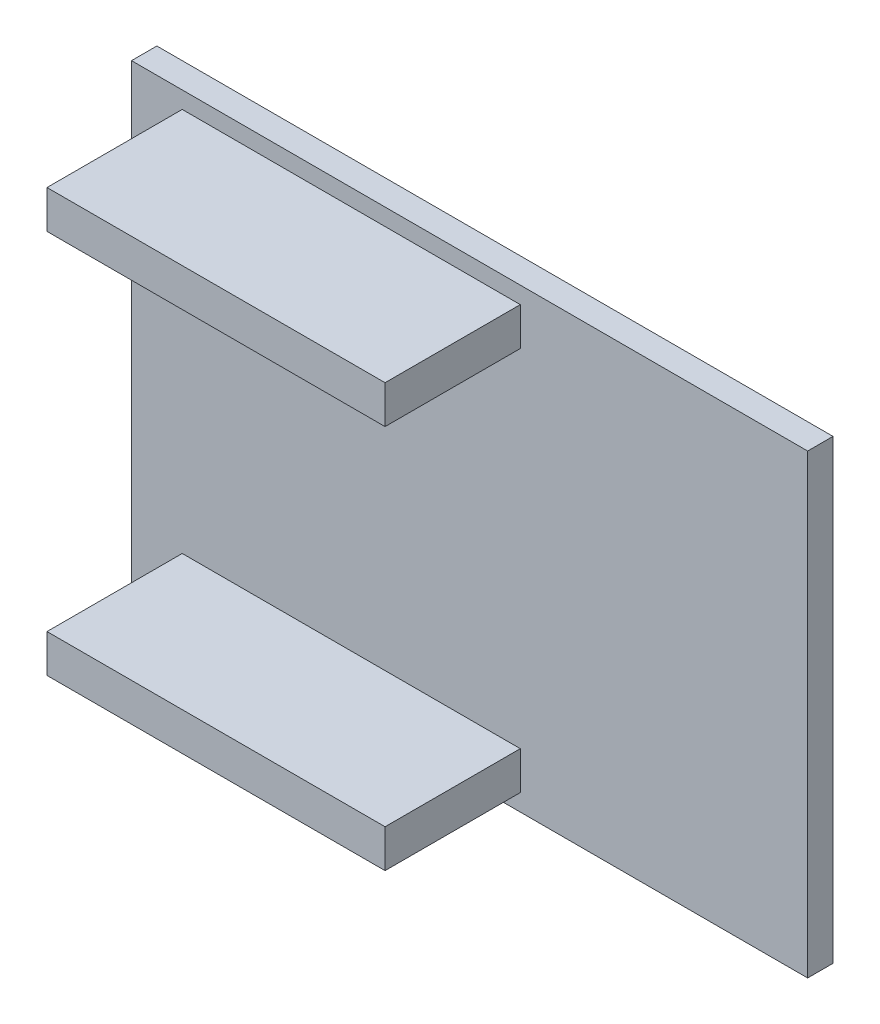
ISO-10303-21;
HEADER;
FILE_DESCRIPTION(('STEP AP214'),'2;1');
FILE_NAME('part.step','',(''),(''),'','','');
FILE_SCHEMA(('AUTOMOTIVE_DESIGN { 1 0 10303 214 1 1 1 1 }'));
ENDSEC;
DATA;
#1=APPLICATION_CONTEXT('core data for automotive mechanical design processes');
#2=APPLICATION_PROTOCOL_DEFINITION('international standard','automotive_design',2000,#1);
#3=PRODUCT_CONTEXT('',#1,'mechanical');
#4=PRODUCT('Part','Part','',(#3));
#5=PRODUCT_RELATED_PRODUCT_CATEGORY('part','',(#4));
#6=PRODUCT_DEFINITION_FORMATION('','',#4);
#7=PRODUCT_DEFINITION_CONTEXT('part definition',#1,'design');
#8=PRODUCT_DEFINITION('design','',#6,#7);
#9=PRODUCT_DEFINITION_SHAPE('','',#8);
#10=(LENGTH_UNIT() NAMED_UNIT(*) SI_UNIT(.MILLI.,.METRE.));
#11=(NAMED_UNIT(*) PLANE_ANGLE_UNIT() SI_UNIT($,.RADIAN.));
#12=(NAMED_UNIT(*) SI_UNIT($,.STERADIAN.) SOLID_ANGLE_UNIT());
#13=UNCERTAINTY_MEASURE_WITH_UNIT(LENGTH_MEASURE(1.E-05),#10,'distance_accuracy_value','');
#14=(GEOMETRIC_REPRESENTATION_CONTEXT(3) GLOBAL_UNCERTAINTY_ASSIGNED_CONTEXT((#13)) GLOBAL_UNIT_ASSIGNED_CONTEXT((#10,
#11,#12)) REPRESENTATION_CONTEXT('',''));
#15=CARTESIAN_POINT('',(0.,0.,0.));
#16=DIRECTION('',(0.,0.,1.));
#17=DIRECTION('',(1.,0.,0.));
#18=AXIS2_PLACEMENT_3D('',#15,#16,#17);
#19=CARTESIAN_POINT('',(0.,0.,1.5));
#20=DIRECTION('',(0.,0.,-1.));
#21=DIRECTION('',(-1.,0.,0.));
#22=AXIS2_PLACEMENT_3D('',#19,#20,#21);
#23=PLANE('',#22);
#24=DIRECTION('',(-1.,0.,0.));
#25=VECTOR('',#24,1.);
#26=CARTESIAN_POINT('',(3.,12.5,1.5));
#27=LINE('',#26,#25);
#28=CARTESIAN_POINT('',(3.,12.5,1.5));
#29=VERTEX_POINT('',#28);
#30=CARTESIAN_POINT('',(-17.,12.5,1.5));
#31=VERTEX_POINT('',#30);
#32=EDGE_CURVE('E144',#29,#31,#27,.T.);
#33=ORIENTED_EDGE('',*,*,#32,.F.);
#34=DIRECTION('',(0.,1.,0.));
#35=VECTOR('',#34,1.);
#36=CARTESIAN_POINT('',(3.,10.25,1.5));
#37=LINE('',#36,#35);
#38=CARTESIAN_POINT('',(3.,10.25,1.5));
#39=VERTEX_POINT('',#38);
#40=EDGE_CURVE('E157',#39,#29,#37,.T.);
#41=ORIENTED_EDGE('',*,*,#40,.F.);
#42=DIRECTION('',(1.,0.,0.));
#43=VECTOR('',#42,1.);
#44=CARTESIAN_POINT('',(-17.,10.25,1.5));
#45=LINE('',#44,#43);
#46=CARTESIAN_POINT('',(-17.,10.25,1.5));
#47=VERTEX_POINT('',#46);
#48=EDGE_CURVE('E166',#47,#39,#45,.T.);
#49=ORIENTED_EDGE('',*,*,#48,.F.);
#50=DIRECTION('',(0.,-1.,0.));
#51=VECTOR('',#50,1.);
#52=CARTESIAN_POINT('',(-17.,12.5,1.5));
#53=LINE('',#52,#51);
#54=EDGE_CURVE('E147',#31,#47,#53,.T.);
#55=ORIENTED_EDGE('',*,*,#54,.F.);
#56=EDGE_LOOP('',(#33,#41,#49,#55));
#57=FACE_BOUND('',#56,.T.);
#58=DIRECTION('',(0.,-1.,0.));
#59=VECTOR('',#58,1.);
#60=CARTESIAN_POINT('',(-20.,13.5,1.5));
#61=LINE('',#60,#59);
#62=CARTESIAN_POINT('',(-20.,13.5,1.5));
#63=VERTEX_POINT('',#62);
#64=CARTESIAN_POINT('',(-20.,-13.5,1.5));
#65=VERTEX_POINT('',#64);
#66=EDGE_CURVE('E183',#63,#65,#61,.T.);
#67=ORIENTED_EDGE('',*,*,#66,.T.);
#68=DIRECTION('',(1.,0.,0.));
#69=VECTOR('',#68,1.);
#70=CARTESIAN_POINT('',(20.,-13.5,1.5));
#71=LINE('',#70,#69);
#72=CARTESIAN_POINT('',(20.,-13.5,1.5));
#73=VERTEX_POINT('',#72);
#74=EDGE_CURVE('E186',#65,#73,#71,.T.);
#75=ORIENTED_EDGE('',*,*,#74,.T.);
#76=DIRECTION('',(0.,1.,0.));
#77=VECTOR('',#76,1.);
#78=CARTESIAN_POINT('',(20.,13.5,1.5));
#79=LINE('',#78,#77);
#80=CARTESIAN_POINT('',(20.,13.5,1.5));
#81=VERTEX_POINT('',#80);
#82=EDGE_CURVE('E189',#73,#81,#79,.T.);
#83=ORIENTED_EDGE('',*,*,#82,.T.);
#84=DIRECTION('',(-1.,0.,0.));
#85=VECTOR('',#84,1.);
#86=CARTESIAN_POINT('',(20.,13.5,1.5));
#87=LINE('',#86,#85);
#88=EDGE_CURVE('E191',#81,#63,#87,.T.);
#89=ORIENTED_EDGE('',*,*,#88,.T.);
#90=EDGE_LOOP('',(#67,#75,#83,#89));
#91=FACE_BOUND('',#90,.T.);
#92=DIRECTION('',(0.,1.,0.));
#93=VECTOR('',#92,1.);
#94=CARTESIAN_POINT('',(3.,-10.25,1.5));
#95=LINE('',#94,#93);
#96=CARTESIAN_POINT('',(3.,-12.5,1.5));
#97=VERTEX_POINT('',#96);
#98=CARTESIAN_POINT('',(3.,-10.25,1.5));
#99=VERTEX_POINT('',#98);
#100=EDGE_CURVE('E143',#97,#99,#95,.T.);
#101=ORIENTED_EDGE('',*,*,#100,.F.);
#102=DIRECTION('',(1.,0.,0.));
#103=VECTOR('',#102,1.);
#104=CARTESIAN_POINT('',(3.,-12.5,1.5));
#105=LINE('',#104,#103);
#106=CARTESIAN_POINT('',(-17.,-12.5,1.5));
#107=VERTEX_POINT('',#106);
#108=EDGE_CURVE('E140',#107,#97,#105,.T.);
#109=ORIENTED_EDGE('',*,*,#108,.F.);
#110=DIRECTION('',(0.,-1.,0.));
#111=VECTOR('',#110,1.);
#112=CARTESIAN_POINT('',(-17.,-12.5,1.5));
#113=LINE('',#112,#111);
#114=CARTESIAN_POINT('',(-17.,-10.25,1.5));
#115=VERTEX_POINT('',#114);
#116=EDGE_CURVE('E54',#115,#107,#113,.T.);
#117=ORIENTED_EDGE('',*,*,#116,.F.);
#118=DIRECTION('',(-1.,0.,0.));
#119=VECTOR('',#118,1.);
#120=CARTESIAN_POINT('',(-17.,-10.25,1.5));
#121=LINE('',#120,#119);
#122=EDGE_CURVE('E49',#99,#115,#121,.T.);
#123=ORIENTED_EDGE('',*,*,#122,.F.);
#124=EDGE_LOOP('',(#101,#109,#117,#123));
#125=FACE_BOUND('',#124,.T.);
#126=ADVANCED_FACE('F34',(#57,#91,#125),#23,.F.);
#127=CARTESIAN_POINT('',(-20.,13.5,1.5));
#128=DIRECTION('',(1.,0.,0.));
#129=DIRECTION('',(0.,0.,-1.));
#130=AXIS2_PLACEMENT_3D('',#127,#128,#129);
#131=PLANE('',#130);
#132=DIRECTION('',(0.,-1.,0.));
#133=VECTOR('',#132,1.);
#134=CARTESIAN_POINT('',(-20.,13.5,0.));
#135=LINE('',#134,#133);
#136=CARTESIAN_POINT('',(-20.,13.5,0.));
#137=VERTEX_POINT('',#136);
#138=CARTESIAN_POINT('',(-20.,-13.5,0.));
#139=VERTEX_POINT('',#138);
#140=EDGE_CURVE('E182',#137,#139,#135,.T.);
#141=ORIENTED_EDGE('',*,*,#140,.T.);
#142=DIRECTION('',(0.,0.,-1.));
#143=VECTOR('',#142,1.);
#144=CARTESIAN_POINT('',(-20.,-13.5,1.5));
#145=LINE('',#144,#143);
#146=EDGE_CURVE('E11',#65,#139,#145,.T.);
#147=ORIENTED_EDGE('',*,*,#146,.F.);
#148=ORIENTED_EDGE('',*,*,#66,.F.);
#149=DIRECTION('',(0.,0.,-1.));
#150=VECTOR('',#149,1.);
#151=CARTESIAN_POINT('',(-20.,13.5,1.5));
#152=LINE('',#151,#150);
#153=EDGE_CURVE('E193',#63,#137,#152,.T.);
#154=ORIENTED_EDGE('',*,*,#153,.T.);
#155=EDGE_LOOP('',(#141,#147,#148,#154));
#156=FACE_BOUND('',#155,.T.);
#157=ADVANCED_FACE('F36',(#156),#131,.F.);
#158=CARTESIAN_POINT('',(20.,-13.5,1.5));
#159=DIRECTION('',(0.,1.,0.));
#160=DIRECTION('',(-1.,0.,0.));
#161=AXIS2_PLACEMENT_3D('',#158,#159,#160);
#162=PLANE('',#161);
#163=DIRECTION('',(1.,0.,0.));
#164=VECTOR('',#163,1.);
#165=CARTESIAN_POINT('',(20.,-13.5,0.));
#166=LINE('',#165,#164);
#167=CARTESIAN_POINT('',(20.,-13.5,0.));
#168=VERTEX_POINT('',#167);
#169=EDGE_CURVE('E196',#139,#168,#166,.T.);
#170=ORIENTED_EDGE('',*,*,#169,.T.);
#171=DIRECTION('',(0.,0.,-1.));
#172=VECTOR('',#171,1.);
#173=CARTESIAN_POINT('',(20.,-13.5,1.5));
#174=LINE('',#173,#172);
#175=EDGE_CURVE('E42',#73,#168,#174,.T.);
#176=ORIENTED_EDGE('',*,*,#175,.F.);
#177=ORIENTED_EDGE('',*,*,#74,.F.);
#178=ORIENTED_EDGE('',*,*,#146,.T.);
#179=EDGE_LOOP('',(#170,#176,#177,#178));
#180=FACE_BOUND('',#179,.T.);
#181=ADVANCED_FACE('F225',(#180),#162,.F.);
#182=CARTESIAN_POINT('',(20.,13.5,1.5));
#183=DIRECTION('',(-1.,0.,0.));
#184=DIRECTION('',(0.,0.,1.));
#185=AXIS2_PLACEMENT_3D('',#182,#183,#184);
#186=PLANE('',#185);
#187=DIRECTION('',(0.,1.,0.));
#188=VECTOR('',#187,1.);
#189=CARTESIAN_POINT('',(20.,13.5,0.));
#190=LINE('',#189,#188);
#191=CARTESIAN_POINT('',(20.,13.5,0.));
#192=VERTEX_POINT('',#191);
#193=EDGE_CURVE('E198',#168,#192,#190,.T.);
#194=ORIENTED_EDGE('',*,*,#193,.T.);
#195=DIRECTION('',(0.,0.,-1.));
#196=VECTOR('',#195,1.);
#197=CARTESIAN_POINT('',(20.,13.5,1.5));
#198=LINE('',#197,#196);
#199=EDGE_CURVE('E203',#81,#192,#198,.T.);
#200=ORIENTED_EDGE('',*,*,#199,.F.);
#201=ORIENTED_EDGE('',*,*,#82,.F.);
#202=ORIENTED_EDGE('',*,*,#175,.T.);
#203=EDGE_LOOP('',(#194,#200,#201,#202));
#204=FACE_BOUND('',#203,.T.);
#205=ADVANCED_FACE('F210',(#204),#186,.F.);
#206=CARTESIAN_POINT('',(20.,13.5,1.5));
#207=DIRECTION('',(0.,-1.,0.));
#208=DIRECTION('',(1.,0.,0.));
#209=AXIS2_PLACEMENT_3D('',#206,#207,#208);
#210=PLANE('',#209);
#211=DIRECTION('',(-1.,0.,0.));
#212=VECTOR('',#211,1.);
#213=CARTESIAN_POINT('',(20.,13.5,0.));
#214=LINE('',#213,#212);
#215=EDGE_CURVE('E187',#192,#137,#214,.T.);
#216=ORIENTED_EDGE('',*,*,#215,.T.);
#217=ORIENTED_EDGE('',*,*,#153,.F.);
#218=ORIENTED_EDGE('',*,*,#88,.F.);
#219=ORIENTED_EDGE('',*,*,#199,.T.);
#220=EDGE_LOOP('',(#216,#217,#218,#219));
#221=FACE_BOUND('',#220,.T.);
#222=ADVANCED_FACE('F219',(#221),#210,.F.);
#223=CARTESIAN_POINT('',(0.,0.,0.));
#224=DIRECTION('',(0.,0.,-1.));
#225=DIRECTION('',(-1.,0.,0.));
#226=AXIS2_PLACEMENT_3D('',#223,#224,#225);
#227=PLANE('',#226);
#228=ORIENTED_EDGE('',*,*,#140,.F.);
#229=ORIENTED_EDGE('',*,*,#215,.F.);
#230=ORIENTED_EDGE('',*,*,#193,.F.);
#231=ORIENTED_EDGE('',*,*,#169,.F.);
#232=EDGE_LOOP('',(#228,#229,#230,#231));
#233=FACE_BOUND('',#232,.T.);
#234=ADVANCED_FACE('F216',(#233),#227,.T.);
#235=CARTESIAN_POINT('',(3.,12.5,9.5));
#236=DIRECTION('',(0.,-1.,0.));
#237=DIRECTION('',(0.,0.,-1.));
#238=AXIS2_PLACEMENT_3D('',#235,#236,#237);
#239=PLANE('',#238);
#240=ORIENTED_EDGE('',*,*,#32,.T.);
#241=DIRECTION('',(0.,0.,-1.));
#242=VECTOR('',#241,1.);
#243=CARTESIAN_POINT('',(-17.,12.5,9.5));
#244=LINE('',#243,#242);
#245=CARTESIAN_POINT('',(-17.,12.5,9.5));
#246=VERTEX_POINT('',#245);
#247=EDGE_CURVE('E179',#246,#31,#244,.T.);
#248=ORIENTED_EDGE('',*,*,#247,.F.);
#249=DIRECTION('',(-1.,0.,0.));
#250=VECTOR('',#249,1.);
#251=CARTESIAN_POINT('',(3.,12.5,9.5));
#252=LINE('',#251,#250);
#253=CARTESIAN_POINT('',(3.,12.5,9.5));
#254=VERTEX_POINT('',#253);
#255=EDGE_CURVE('E153',#254,#246,#252,.T.);
#256=ORIENTED_EDGE('',*,*,#255,.F.);
#257=DIRECTION('',(0.,0.,-1.));
#258=VECTOR('',#257,1.);
#259=CARTESIAN_POINT('',(3.,12.5,9.5));
#260=LINE('',#259,#258);
#261=EDGE_CURVE('E162',#254,#29,#260,.T.);
#262=ORIENTED_EDGE('',*,*,#261,.T.);
#263=EDGE_LOOP('',(#240,#248,#256,#262));
#264=FACE_BOUND('',#263,.T.);
#265=ADVANCED_FACE('F239',(#264),#239,.F.);
#266=CARTESIAN_POINT('',(-17.,12.5,9.5));
#267=DIRECTION('',(1.,0.,0.));
#268=DIRECTION('',(0.,0.,-1.));
#269=AXIS2_PLACEMENT_3D('',#266,#267,#268);
#270=PLANE('',#269);
#271=ORIENTED_EDGE('',*,*,#54,.T.);
#272=DIRECTION('',(0.,0.,-1.));
#273=VECTOR('',#272,1.);
#274=CARTESIAN_POINT('',(-17.,10.25,9.5));
#275=LINE('',#274,#273);
#276=CARTESIAN_POINT('',(-17.,10.25,9.5));
#277=VERTEX_POINT('',#276);
#278=EDGE_CURVE('E176',#277,#47,#275,.T.);
#279=ORIENTED_EDGE('',*,*,#278,.F.);
#280=DIRECTION('',(0.,-1.,0.));
#281=VECTOR('',#280,1.);
#282=CARTESIAN_POINT('',(-17.,12.5,9.5));
#283=LINE('',#282,#281);
#284=EDGE_CURVE('E156',#246,#277,#283,.T.);
#285=ORIENTED_EDGE('',*,*,#284,.F.);
#286=ORIENTED_EDGE('',*,*,#247,.T.);
#287=EDGE_LOOP('',(#271,#279,#285,#286));
#288=FACE_BOUND('',#287,.T.);
#289=ADVANCED_FACE('F258',(#288),#270,.F.);
#290=CARTESIAN_POINT('',(-17.,10.25,9.5));
#291=DIRECTION('',(0.,1.,0.));
#292=DIRECTION('',(0.,0.,1.));
#293=AXIS2_PLACEMENT_3D('',#290,#291,#292);
#294=PLANE('',#293);
#295=ORIENTED_EDGE('',*,*,#48,.T.);
#296=DIRECTION('',(0.,0.,-1.));
#297=VECTOR('',#296,1.);
#298=CARTESIAN_POINT('',(3.,10.25,9.5));
#299=LINE('',#298,#297);
#300=CARTESIAN_POINT('',(3.,10.25,9.5));
#301=VERTEX_POINT('',#300);
#302=EDGE_CURVE('E173',#301,#39,#299,.T.);
#303=ORIENTED_EDGE('',*,*,#302,.F.);
#304=DIRECTION('',(1.,0.,0.));
#305=VECTOR('',#304,1.);
#306=CARTESIAN_POINT('',(-17.,10.25,9.5));
#307=LINE('',#306,#305);
#308=EDGE_CURVE('E159',#277,#301,#307,.T.);
#309=ORIENTED_EDGE('',*,*,#308,.F.);
#310=ORIENTED_EDGE('',*,*,#278,.T.);
#311=EDGE_LOOP('',(#295,#303,#309,#310));
#312=FACE_BOUND('',#311,.T.);
#313=ADVANCED_FACE('F265',(#312),#294,.F.);
#314=CARTESIAN_POINT('',(3.,10.25,9.5));
#315=DIRECTION('',(-1.,0.,0.));
#316=DIRECTION('',(0.,0.,1.));
#317=AXIS2_PLACEMENT_3D('',#314,#315,#316);
#318=PLANE('',#317);
#319=ORIENTED_EDGE('',*,*,#40,.T.);
#320=ORIENTED_EDGE('',*,*,#261,.F.);
#321=DIRECTION('',(0.,1.,0.));
#322=VECTOR('',#321,1.);
#323=CARTESIAN_POINT('',(3.,10.25,9.5));
#324=LINE('',#323,#322);
#325=EDGE_CURVE('E161',#301,#254,#324,.T.);
#326=ORIENTED_EDGE('',*,*,#325,.F.);
#327=ORIENTED_EDGE('',*,*,#302,.T.);
#328=EDGE_LOOP('',(#319,#320,#326,#327));
#329=FACE_BOUND('',#328,.T.);
#330=ADVANCED_FACE('F272',(#329),#318,.F.);
#331=CARTESIAN_POINT('',(0.,0.,9.5));
#332=DIRECTION('',(0.,0.,1.));
#333=DIRECTION('',(1.,0.,0.));
#334=AXIS2_PLACEMENT_3D('',#331,#332,#333);
#335=PLANE('',#334);
#336=ORIENTED_EDGE('',*,*,#255,.T.);
#337=ORIENTED_EDGE('',*,*,#284,.T.);
#338=ORIENTED_EDGE('',*,*,#308,.T.);
#339=ORIENTED_EDGE('',*,*,#325,.T.);
#340=EDGE_LOOP('',(#336,#337,#338,#339));
#341=FACE_BOUND('',#340,.T.);
#342=ADVANCED_FACE('F280',(#341),#335,.T.);
#343=CARTESIAN_POINT('',(3.,-10.25,9.5));
#344=DIRECTION('',(-1.,0.,0.));
#345=DIRECTION('',(0.,0.,1.));
#346=AXIS2_PLACEMENT_3D('',#343,#344,#345);
#347=PLANE('',#346);
#348=ORIENTED_EDGE('',*,*,#100,.T.);
#349=DIRECTION('',(0.,0.,-1.));
#350=VECTOR('',#349,1.);
#351=CARTESIAN_POINT('',(3.,-10.25,9.5));
#352=LINE('',#351,#350);
#353=CARTESIAN_POINT('',(3.,-10.25,9.5));
#354=VERTEX_POINT('',#353);
#355=EDGE_CURVE('E124',#354,#99,#352,.T.);
#356=ORIENTED_EDGE('',*,*,#355,.F.);
#357=DIRECTION('',(0.,1.,0.));
#358=VECTOR('',#357,1.);
#359=CARTESIAN_POINT('',(3.,-10.25,9.5));
#360=LINE('',#359,#358);
#361=CARTESIAN_POINT('',(3.,-12.5,9.5));
#362=VERTEX_POINT('',#361);
#363=EDGE_CURVE('E131',#362,#354,#360,.T.);
#364=ORIENTED_EDGE('',*,*,#363,.F.);
#365=DIRECTION('',(0.,0.,-1.));
#366=VECTOR('',#365,1.);
#367=CARTESIAN_POINT('',(3.,-12.5,9.5));
#368=LINE('',#367,#366);
#369=EDGE_CURVE('E369',#362,#97,#368,.T.);
#370=ORIENTED_EDGE('',*,*,#369,.T.);
#371=EDGE_LOOP('',(#348,#356,#364,#370));
#372=FACE_BOUND('',#371,.T.);
#373=ADVANCED_FACE('F142',(#372),#347,.F.);
#374=CARTESIAN_POINT('',(-17.,-10.25,9.5));
#375=DIRECTION('',(0.,-1.,0.));
#376=DIRECTION('',(0.,0.,-1.));
#377=AXIS2_PLACEMENT_3D('',#374,#375,#376);
#378=PLANE('',#377);
#379=ORIENTED_EDGE('',*,*,#122,.T.);
#380=DIRECTION('',(0.,0.,-1.));
#381=VECTOR('',#380,1.);
#382=CARTESIAN_POINT('',(-17.,-10.25,9.5));
#383=LINE('',#382,#381);
#384=CARTESIAN_POINT('',(-17.,-10.25,9.5));
#385=VERTEX_POINT('',#384);
#386=EDGE_CURVE('E127',#385,#115,#383,.T.);
#387=ORIENTED_EDGE('',*,*,#386,.F.);
#388=DIRECTION('',(-1.,0.,0.));
#389=VECTOR('',#388,1.);
#390=CARTESIAN_POINT('',(-17.,-10.25,9.5));
#391=LINE('',#390,#389);
#392=EDGE_CURVE('E120',#354,#385,#391,.T.);
#393=ORIENTED_EDGE('',*,*,#392,.F.);
#394=ORIENTED_EDGE('',*,*,#355,.T.);
#395=EDGE_LOOP('',(#379,#387,#393,#394));
#396=FACE_BOUND('',#395,.T.);
#397=ADVANCED_FACE('F122',(#396),#378,.F.);
#398=CARTESIAN_POINT('',(-17.,-12.5,9.5));
#399=DIRECTION('',(1.,0.,0.));
#400=DIRECTION('',(0.,0.,-1.));
#401=AXIS2_PLACEMENT_3D('',#398,#399,#400);
#402=PLANE('',#401);
#403=ORIENTED_EDGE('',*,*,#116,.T.);
#404=DIRECTION('',(0.,0.,-1.));
#405=VECTOR('',#404,1.);
#406=CARTESIAN_POINT('',(-17.,-12.5,9.5));
#407=LINE('',#406,#405);
#408=CARTESIAN_POINT('',(-17.,-12.5,9.5));
#409=VERTEX_POINT('',#408);
#410=EDGE_CURVE('E149',#409,#107,#407,.T.);
#411=ORIENTED_EDGE('',*,*,#410,.F.);
#412=DIRECTION('',(0.,-1.,0.));
#413=VECTOR('',#412,1.);
#414=CARTESIAN_POINT('',(-17.,-12.5,9.5));
#415=LINE('',#414,#413);
#416=EDGE_CURVE('E130',#385,#409,#415,.T.);
#417=ORIENTED_EDGE('',*,*,#416,.F.);
#418=ORIENTED_EDGE('',*,*,#386,.T.);
#419=EDGE_LOOP('',(#403,#411,#417,#418));
#420=FACE_BOUND('',#419,.T.);
#421=ADVANCED_FACE('F301',(#420),#402,.F.);
#422=CARTESIAN_POINT('',(3.,-12.5,9.5));
#423=DIRECTION('',(0.,1.,0.));
#424=DIRECTION('',(0.,0.,1.));
#425=AXIS2_PLACEMENT_3D('',#422,#423,#424);
#426=PLANE('',#425);
#427=ORIENTED_EDGE('',*,*,#108,.T.);
#428=ORIENTED_EDGE('',*,*,#369,.F.);
#429=DIRECTION('',(1.,0.,0.));
#430=VECTOR('',#429,1.);
#431=CARTESIAN_POINT('',(3.,-12.5,9.5));
#432=LINE('',#431,#430);
#433=EDGE_CURVE('E136',#409,#362,#432,.T.);
#434=ORIENTED_EDGE('',*,*,#433,.F.);
#435=ORIENTED_EDGE('',*,*,#410,.T.);
#436=EDGE_LOOP('',(#427,#428,#434,#435));
#437=FACE_BOUND('',#436,.T.);
#438=ADVANCED_FACE('F308',(#437),#426,.F.);
#439=CARTESIAN_POINT('',(0.,0.,9.5));
#440=DIRECTION('',(0.,0.,-1.));
#441=DIRECTION('',(-1.,0.,0.));
#442=AXIS2_PLACEMENT_3D('',#439,#440,#441);
#443=PLANE('',#442);
#444=ORIENTED_EDGE('',*,*,#363,.T.);
#445=ORIENTED_EDGE('',*,*,#392,.T.);
#446=ORIENTED_EDGE('',*,*,#416,.T.);
#447=ORIENTED_EDGE('',*,*,#433,.T.);
#448=EDGE_LOOP('',(#444,#445,#446,#447));
#449=FACE_BOUND('',#448,.T.);
#450=ADVANCED_FACE('F134',(#449),#443,.F.);
#451=CLOSED_SHELL('',(#126,#157,#181,#205,#222,#234,#265,#289,#313,#330,#342,#373,#397,#421,
#438,#450));
#452=MANIFOLD_SOLID_BREP('B2',#451);
#453=ADVANCED_BREP_SHAPE_REPRESENTATION('',(#18,#452),#14);
#454=SHAPE_DEFINITION_REPRESENTATION(#9,#453);
ENDSEC;
END-ISO-10303-21;
